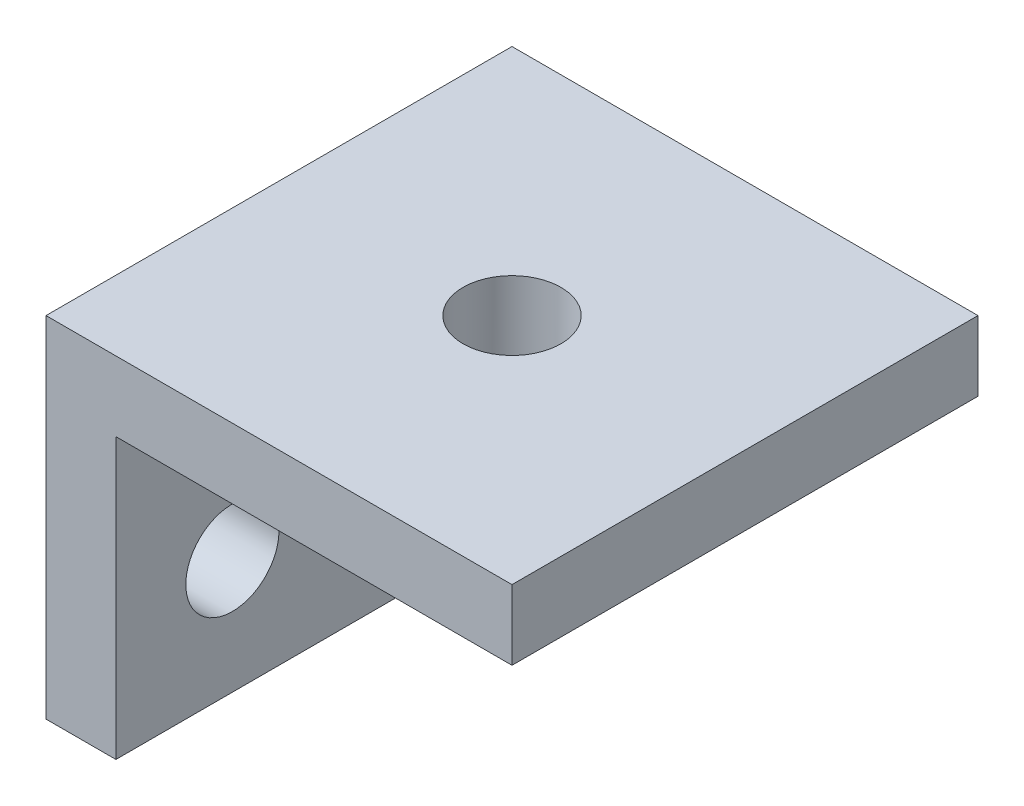
ISO-10303-21;
HEADER;
FILE_DESCRIPTION(('STEP AP214'),'2;1');
FILE_NAME('part.step','',(''),(''),'','','');
FILE_SCHEMA(('AUTOMOTIVE_DESIGN { 1 0 10303 214 1 1 1 1 }'));
ENDSEC;
DATA;
#1=APPLICATION_CONTEXT('core data for automotive mechanical design processes');
#2=APPLICATION_PROTOCOL_DEFINITION('international standard','automotive_design',2000,#1);
#3=PRODUCT_CONTEXT('',#1,'mechanical');
#4=PRODUCT('Part','Part','',(#3));
#5=PRODUCT_RELATED_PRODUCT_CATEGORY('part','',(#4));
#6=PRODUCT_DEFINITION_FORMATION('','',#4);
#7=PRODUCT_DEFINITION_CONTEXT('part definition',#1,'design');
#8=PRODUCT_DEFINITION('design','',#6,#7);
#9=PRODUCT_DEFINITION_SHAPE('','',#8);
#10=(LENGTH_UNIT() NAMED_UNIT(*) SI_UNIT(.MILLI.,.METRE.));
#11=(NAMED_UNIT(*) PLANE_ANGLE_UNIT() SI_UNIT($,.RADIAN.));
#12=(NAMED_UNIT(*) SI_UNIT($,.STERADIAN.) SOLID_ANGLE_UNIT());
#13=UNCERTAINTY_MEASURE_WITH_UNIT(LENGTH_MEASURE(1.E-05),#10,'distance_accuracy_value','');
#14=(GEOMETRIC_REPRESENTATION_CONTEXT(3) GLOBAL_UNCERTAINTY_ASSIGNED_CONTEXT((#13)) GLOBAL_UNIT_ASSIGNED_CONTEXT((#10,
#11,#12)) REPRESENTATION_CONTEXT('',''));
#15=CARTESIAN_POINT('',(0.,0.,0.));
#16=DIRECTION('',(0.,0.,1.));
#17=DIRECTION('',(1.,0.,0.));
#18=AXIS2_PLACEMENT_3D('',#15,#16,#17);
#19=CARTESIAN_POINT('',(-36.,-10.,20.));
#20=DIRECTION('',(-1.,0.,0.));
#21=DIRECTION('',(0.,0.,1.));
#22=AXIS2_PLACEMENT_3D('',#19,#20,#21);
#23=PLANE('',#22);
#24=CARTESIAN_POINT('',(-36.,-20.,15.));
#25=DIRECTION('',(1.,0.,0.));
#26=DIRECTION('',(0.,0.,-1.));
#27=AXIS2_PLACEMENT_3D('',#24,#25,#26);
#28=CIRCLE('',#27,1.99999999999999);
#29=CARTESIAN_POINT('',(-36.,-20.,13.));
#30=VERTEX_POINT('',#29);
#31=EDGE_CURVE('E161',#30,#30,#28,.T.);
#32=ORIENTED_EDGE('',*,*,#31,.T.);
#33=EDGE_LOOP('',(#32));
#34=FACE_BOUND('',#33,.T.);
#35=CARTESIAN_POINT('',(-36.,-20.,5.));
#36=DIRECTION('',(1.,0.,0.));
#37=DIRECTION('',(0.,0.,-1.));
#38=AXIS2_PLACEMENT_3D('',#35,#36,#37);
#39=CIRCLE('',#38,1.99999999999999);
#40=CARTESIAN_POINT('',(-36.,-20.,3.00000000000001));
#41=VERTEX_POINT('',#40);
#42=EDGE_CURVE('E164',#41,#41,#39,.T.);
#43=ORIENTED_EDGE('',*,*,#42,.T.);
#44=EDGE_LOOP('',(#43));
#45=FACE_BOUND('',#44,.T.);
#46=DIRECTION('',(0.,0.,-1.));
#47=VECTOR('',#46,1.);
#48=CARTESIAN_POINT('',(-36.,-25.,20.));
#49=LINE('',#48,#47);
#50=CARTESIAN_POINT('',(-36.,-25.,20.));
#51=VERTEX_POINT('',#50);
#52=CARTESIAN_POINT('',(-36.,-25.,0.));
#53=VERTEX_POINT('',#52);
#54=EDGE_CURVE('E118',#51,#53,#49,.T.);
#55=ORIENTED_EDGE('',*,*,#54,.F.);
#56=DIRECTION('',(0.,-1.,0.));
#57=VECTOR('',#56,1.);
#58=CARTESIAN_POINT('',(-36.,-10.,20.));
#59=LINE('',#58,#57);
#60=CARTESIAN_POINT('',(-36.,-10.,20.));
#61=VERTEX_POINT('',#60);
#62=EDGE_CURVE('E11',#61,#51,#59,.T.);
#63=ORIENTED_EDGE('',*,*,#62,.F.);
#64=DIRECTION('',(0.,0.,-1.));
#65=VECTOR('',#64,1.);
#66=CARTESIAN_POINT('',(-36.,-10.,20.));
#67=LINE('',#66,#65);
#68=CARTESIAN_POINT('',(-36.,-10.,0.));
#69=VERTEX_POINT('',#68);
#70=EDGE_CURVE('E121',#61,#69,#67,.T.);
#71=ORIENTED_EDGE('',*,*,#70,.T.);
#72=DIRECTION('',(0.,-1.,0.));
#73=VECTOR('',#72,1.);
#74=CARTESIAN_POINT('',(-36.,-10.,0.));
#75=LINE('',#74,#73);
#76=EDGE_CURVE('E35',#69,#53,#75,.T.);
#77=ORIENTED_EDGE('',*,*,#76,.T.);
#78=EDGE_LOOP('',(#55,#63,#71,#77));
#79=FACE_BOUND('',#78,.T.);
#80=ADVANCED_FACE('F32',(#34,#45,#79),#23,.T.);
#81=CARTESIAN_POINT('',(-16.,-10.,20.));
#82=DIRECTION('',(0.,0.,1.));
#83=DIRECTION('',(1.,0.,0.));
#84=AXIS2_PLACEMENT_3D('',#81,#82,#83);
#85=PLANE('',#84);
#86=DIRECTION('',(1.,0.,0.));
#87=VECTOR('',#86,1.);
#88=CARTESIAN_POINT('',(-33.,-13.,20.));
#89=LINE('',#88,#87);
#90=CARTESIAN_POINT('',(-33.,-13.,20.));
#91=VERTEX_POINT('',#90);
#92=CARTESIAN_POINT('',(-16.,-13.,20.));
#93=VERTEX_POINT('',#92);
#94=EDGE_CURVE('E103',#91,#93,#89,.T.);
#95=ORIENTED_EDGE('',*,*,#94,.T.);
#96=DIRECTION('',(0.,-1.,0.));
#97=VECTOR('',#96,1.);
#98=CARTESIAN_POINT('',(-16.,-10.,20.));
#99=LINE('',#98,#97);
#100=CARTESIAN_POINT('',(-16.,-10.,20.));
#101=VERTEX_POINT('',#100);
#102=EDGE_CURVE('E40',#101,#93,#99,.T.);
#103=ORIENTED_EDGE('',*,*,#102,.F.);
#104=DIRECTION('',(-1.,0.,0.));
#105=VECTOR('',#104,1.);
#106=CARTESIAN_POINT('',(-16.,-10.,20.));
#107=LINE('',#106,#105);
#108=EDGE_CURVE('E128',#101,#61,#107,.T.);
#109=ORIENTED_EDGE('',*,*,#108,.T.);
#110=ORIENTED_EDGE('',*,*,#62,.T.);
#111=DIRECTION('',(-1.,0.,0.));
#112=VECTOR('',#111,1.);
#113=CARTESIAN_POINT('',(-16.,-25.,20.));
#114=LINE('',#113,#112);
#115=CARTESIAN_POINT('',(-33.,-25.,20.));
#116=VERTEX_POINT('',#115);
#117=EDGE_CURVE('E71',#116,#51,#114,.T.);
#118=ORIENTED_EDGE('',*,*,#117,.F.);
#119=DIRECTION('',(0.,1.,0.));
#120=VECTOR('',#119,1.);
#121=CARTESIAN_POINT('',(-33.,-25.,20.));
#122=LINE('',#121,#120);
#123=EDGE_CURVE('E48',#116,#91,#122,.T.);
#124=ORIENTED_EDGE('',*,*,#123,.T.);
#125=EDGE_LOOP('',(#95,#103,#109,#110,#118,#124));
#126=FACE_BOUND('',#125,.T.);
#127=ADVANCED_FACE('F109',(#126),#85,.T.);
#128=CARTESIAN_POINT('',(-16.,-10.,0.));
#129=DIRECTION('',(1.,0.,0.));
#130=DIRECTION('',(0.,0.,-1.));
#131=AXIS2_PLACEMENT_3D('',#128,#129,#130);
#132=PLANE('',#131);
#133=DIRECTION('',(0.,0.,-1.));
#134=VECTOR('',#133,1.);
#135=CARTESIAN_POINT('',(-16.,-13.,20.));
#136=LINE('',#135,#134);
#137=CARTESIAN_POINT('',(-16.,-13.,0.));
#138=VERTEX_POINT('',#137);
#139=EDGE_CURVE('E99',#93,#138,#136,.T.);
#140=ORIENTED_EDGE('',*,*,#139,.T.);
#141=DIRECTION('',(0.,-1.,0.));
#142=VECTOR('',#141,1.);
#143=CARTESIAN_POINT('',(-16.,-10.,0.));
#144=LINE('',#143,#142);
#145=CARTESIAN_POINT('',(-16.,-10.,0.));
#146=VERTEX_POINT('',#145);
#147=EDGE_CURVE('E136',#146,#138,#144,.T.);
#148=ORIENTED_EDGE('',*,*,#147,.F.);
#149=DIRECTION('',(0.,0.,1.));
#150=VECTOR('',#149,1.);
#151=CARTESIAN_POINT('',(-16.,-10.,0.));
#152=LINE('',#151,#150);
#153=EDGE_CURVE('E125',#146,#101,#152,.T.);
#154=ORIENTED_EDGE('',*,*,#153,.T.);
#155=ORIENTED_EDGE('',*,*,#102,.T.);
#156=EDGE_LOOP('',(#140,#148,#154,#155));
#157=FACE_BOUND('',#156,.T.);
#158=ADVANCED_FACE('F157',(#157),#132,.T.);
#159=CARTESIAN_POINT('',(-36.,-10.,0.));
#160=DIRECTION('',(0.,0.,-1.));
#161=DIRECTION('',(-1.,0.,0.));
#162=AXIS2_PLACEMENT_3D('',#159,#160,#161);
#163=PLANE('',#162);
#164=DIRECTION('',(1.,0.,0.));
#165=VECTOR('',#164,1.);
#166=CARTESIAN_POINT('',(-33.,-13.,0.));
#167=LINE('',#166,#165);
#168=CARTESIAN_POINT('',(-33.,-13.,0.));
#169=VERTEX_POINT('',#168);
#170=EDGE_CURVE('E110',#169,#138,#167,.T.);
#171=ORIENTED_EDGE('',*,*,#170,.F.);
#172=DIRECTION('',(0.,1.,0.));
#173=VECTOR('',#172,1.);
#174=CARTESIAN_POINT('',(-33.,-25.,0.));
#175=LINE('',#174,#173);
#176=CARTESIAN_POINT('',(-33.,-25.,0.));
#177=VERTEX_POINT('',#176);
#178=EDGE_CURVE('E96',#177,#169,#175,.T.);
#179=ORIENTED_EDGE('',*,*,#178,.F.);
#180=DIRECTION('',(1.,0.,0.));
#181=VECTOR('',#180,1.);
#182=CARTESIAN_POINT('',(-36.,-25.,0.));
#183=LINE('',#182,#181);
#184=EDGE_CURVE('E132',#53,#177,#183,.T.);
#185=ORIENTED_EDGE('',*,*,#184,.F.);
#186=ORIENTED_EDGE('',*,*,#76,.F.);
#187=DIRECTION('',(1.,0.,0.));
#188=VECTOR('',#187,1.);
#189=CARTESIAN_POINT('',(-36.,-10.,0.));
#190=LINE('',#189,#188);
#191=EDGE_CURVE('E123',#69,#146,#190,.T.);
#192=ORIENTED_EDGE('',*,*,#191,.T.);
#193=ORIENTED_EDGE('',*,*,#147,.T.);
#194=EDGE_LOOP('',(#171,#179,#185,#186,#192,#193));
#195=FACE_BOUND('',#194,.T.);
#196=ADVANCED_FACE('F138',(#195),#163,.T.);
#197=CARTESIAN_POINT('',(0.,-10.,0.));
#198=DIRECTION('',(0.,-1.,0.));
#199=DIRECTION('',(0.,0.,-1.));
#200=AXIS2_PLACEMENT_3D('',#197,#198,#199);
#201=PLANE('',#200);
#202=CARTESIAN_POINT('',(-26.,-10.,10.));
#203=DIRECTION('',(0.,1.,0.));
#204=DIRECTION('',(0.,0.,1.));
#205=AXIS2_PLACEMENT_3D('',#202,#203,#204);
#206=CIRCLE('',#205,2.09999999999999);
#207=CARTESIAN_POINT('',(-26.,-10.,12.1));
#208=VERTEX_POINT('',#207);
#209=EDGE_CURVE('E166',#208,#208,#206,.T.);
#210=ORIENTED_EDGE('',*,*,#209,.F.);
#211=EDGE_LOOP('',(#210));
#212=FACE_BOUND('',#211,.T.);
#213=ORIENTED_EDGE('',*,*,#70,.F.);
#214=ORIENTED_EDGE('',*,*,#108,.F.);
#215=ORIENTED_EDGE('',*,*,#153,.F.);
#216=ORIENTED_EDGE('',*,*,#191,.F.);
#217=EDGE_LOOP('',(#213,#214,#215,#216));
#218=FACE_BOUND('',#217,.T.);
#219=ADVANCED_FACE('F141',(#212,#218),#201,.F.);
#220=CARTESIAN_POINT('',(0.,-25.,0.));
#221=DIRECTION('',(0.,-1.,0.));
#222=DIRECTION('',(0.,0.,-1.));
#223=AXIS2_PLACEMENT_3D('',#220,#221,#222);
#224=PLANE('',#223);
#225=DIRECTION('',(0.,0.,-1.));
#226=VECTOR('',#225,1.);
#227=CARTESIAN_POINT('',(-33.,-25.,20.));
#228=LINE('',#227,#226);
#229=EDGE_CURVE('E100',#116,#177,#228,.T.);
#230=ORIENTED_EDGE('',*,*,#229,.F.);
#231=ORIENTED_EDGE('',*,*,#117,.T.);
#232=ORIENTED_EDGE('',*,*,#54,.T.);
#233=ORIENTED_EDGE('',*,*,#184,.T.);
#234=EDGE_LOOP('',(#230,#231,#232,#233));
#235=FACE_BOUND('',#234,.T.);
#236=ADVANCED_FACE('F139',(#235),#224,.T.);
#237=CARTESIAN_POINT('',(-33.,-13.,20.));
#238=DIRECTION('',(0.,1.,0.));
#239=DIRECTION('',(-1.,0.,0.));
#240=AXIS2_PLACEMENT_3D('',#237,#238,#239);
#241=PLANE('',#240);
#242=CARTESIAN_POINT('',(-26.,-13.,10.));
#243=DIRECTION('',(0.,1.,0.));
#244=DIRECTION('',(-1.,0.,0.));
#245=AXIS2_PLACEMENT_3D('',#242,#243,#244);
#246=CIRCLE('',#245,2.09999999999999);
#247=CARTESIAN_POINT('',(-28.1,-13.,10.));
#248=VERTEX_POINT('',#247);
#249=EDGE_CURVE('E114',#248,#248,#246,.T.);
#250=ORIENTED_EDGE('',*,*,#249,.T.);
#251=EDGE_LOOP('',(#250));
#252=FACE_BOUND('',#251,.T.);
#253=ORIENTED_EDGE('',*,*,#170,.T.);
#254=ORIENTED_EDGE('',*,*,#139,.F.);
#255=ORIENTED_EDGE('',*,*,#94,.F.);
#256=DIRECTION('',(0.,0.,-1.));
#257=VECTOR('',#256,1.);
#258=CARTESIAN_POINT('',(-33.,-13.,20.));
#259=LINE('',#258,#257);
#260=EDGE_CURVE('E92',#91,#169,#259,.T.);
#261=ORIENTED_EDGE('',*,*,#260,.T.);
#262=EDGE_LOOP('',(#253,#254,#255,#261));
#263=FACE_BOUND('',#262,.T.);
#264=ADVANCED_FACE('F104',(#252,#263),#241,.F.);
#265=CARTESIAN_POINT('',(-33.,-25.,20.));
#266=DIRECTION('',(-1.,0.,0.));
#267=DIRECTION('',(0.,0.,1.));
#268=AXIS2_PLACEMENT_3D('',#265,#266,#267);
#269=PLANE('',#268);
#270=CARTESIAN_POINT('',(-33.,-20.,15.));
#271=DIRECTION('',(1.,0.,0.));
#272=DIRECTION('',(0.,0.,-1.));
#273=AXIS2_PLACEMENT_3D('',#270,#271,#272);
#274=CIRCLE('',#273,1.99999999999999);
#275=CARTESIAN_POINT('',(-33.,-20.,13.));
#276=VERTEX_POINT('',#275);
#277=EDGE_CURVE('E174',#276,#276,#274,.T.);
#278=ORIENTED_EDGE('',*,*,#277,.F.);
#279=EDGE_LOOP('',(#278));
#280=FACE_BOUND('',#279,.T.);
#281=CARTESIAN_POINT('',(-33.,-20.,5.));
#282=DIRECTION('',(1.,0.,0.));
#283=DIRECTION('',(0.,0.,-1.));
#284=AXIS2_PLACEMENT_3D('',#281,#282,#283);
#285=CIRCLE('',#284,1.99999999999999);
#286=CARTESIAN_POINT('',(-33.,-20.,3.00000000000001));
#287=VERTEX_POINT('',#286);
#288=EDGE_CURVE('E167',#287,#287,#285,.T.);
#289=ORIENTED_EDGE('',*,*,#288,.F.);
#290=EDGE_LOOP('',(#289));
#291=FACE_BOUND('',#290,.T.);
#292=ORIENTED_EDGE('',*,*,#178,.T.);
#293=ORIENTED_EDGE('',*,*,#260,.F.);
#294=ORIENTED_EDGE('',*,*,#123,.F.);
#295=ORIENTED_EDGE('',*,*,#229,.T.);
#296=EDGE_LOOP('',(#292,#293,#294,#295));
#297=FACE_BOUND('',#296,.T.);
#298=ADVANCED_FACE('F94',(#280,#291,#297),#269,.F.);
#299=CARTESIAN_POINT('',(-26.,-10.,10.));
#300=DIRECTION('',(0.,1.,0.));
#301=DIRECTION('',(0.,0.,1.));
#302=AXIS2_PLACEMENT_3D('',#299,#300,#301);
#303=CYLINDRICAL_SURFACE('',#302,2.09999999999999);
#304=ORIENTED_EDGE('',*,*,#209,.T.);
#305=EDGE_LOOP('',(#304));
#306=FACE_BOUND('',#305,.T.);
#307=ORIENTED_EDGE('',*,*,#249,.F.);
#308=EDGE_LOOP('',(#307));
#309=FACE_BOUND('',#308,.T.);
#310=ADVANCED_FACE('F182',(#306,#309),#303,.F.);
#311=CARTESIAN_POINT('',(-33.,-20.,5.));
#312=DIRECTION('',(1.,0.,0.));
#313=DIRECTION('',(0.,0.,-1.));
#314=AXIS2_PLACEMENT_3D('',#311,#312,#313);
#315=CYLINDRICAL_SURFACE('',#314,1.99999999999999);
#316=ORIENTED_EDGE('',*,*,#42,.F.);
#317=EDGE_LOOP('',(#316));
#318=FACE_BOUND('',#317,.T.);
#319=ORIENTED_EDGE('',*,*,#288,.T.);
#320=EDGE_LOOP('',(#319));
#321=FACE_BOUND('',#320,.T.);
#322=ADVANCED_FACE('F186',(#318,#321),#315,.F.);
#323=CARTESIAN_POINT('',(-33.,-20.,15.));
#324=DIRECTION('',(1.,0.,0.));
#325=DIRECTION('',(0.,0.,-1.));
#326=AXIS2_PLACEMENT_3D('',#323,#324,#325);
#327=CYLINDRICAL_SURFACE('',#326,1.99999999999999);
#328=ORIENTED_EDGE('',*,*,#31,.F.);
#329=EDGE_LOOP('',(#328));
#330=FACE_BOUND('',#329,.T.);
#331=ORIENTED_EDGE('',*,*,#277,.T.);
#332=EDGE_LOOP('',(#331));
#333=FACE_BOUND('',#332,.T.);
#334=ADVANCED_FACE('F178',(#330,#333),#327,.F.);
#335=CLOSED_SHELL('',(#80,#127,#158,#196,#219,#236,#264,#298,#310,#322,#334));
#336=MANIFOLD_SOLID_BREP('B2',#335);
#337=ADVANCED_BREP_SHAPE_REPRESENTATION('',(#18,#336),#14);
#338=SHAPE_DEFINITION_REPRESENTATION(#9,#337);
ENDSEC;
END-ISO-10303-21;
